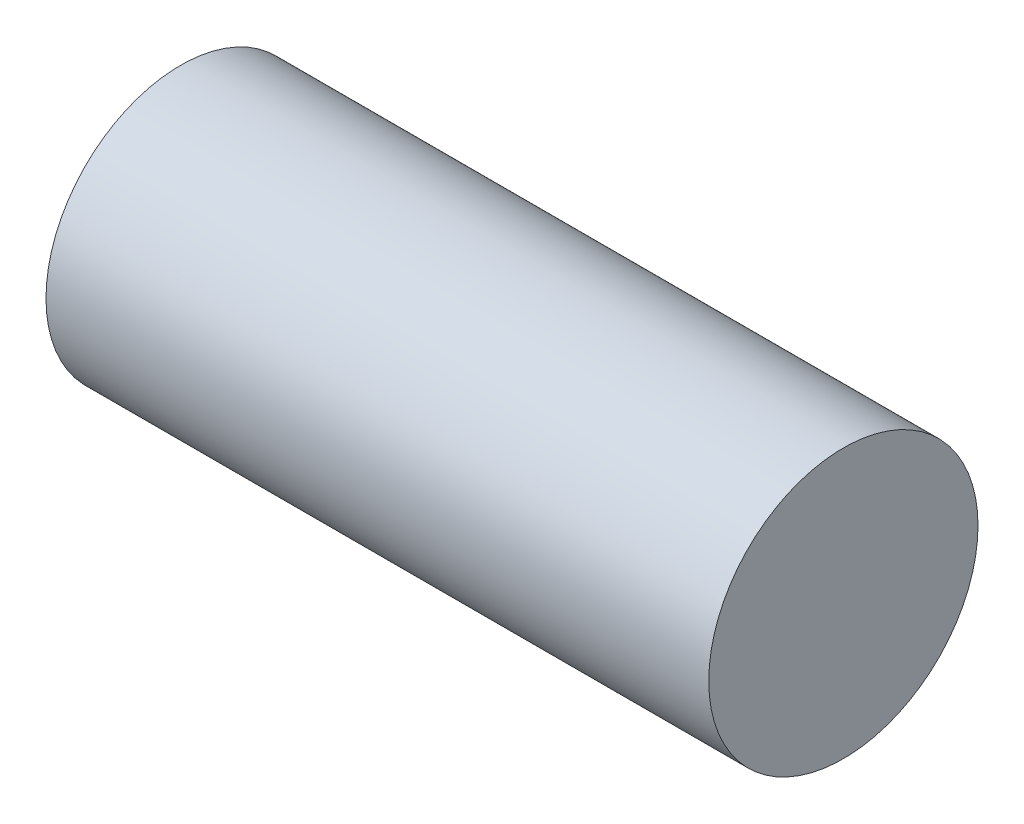
ISO-10303-21;
HEADER;
FILE_DESCRIPTION(('STEP AP214'),'2;1');
FILE_NAME('part.step','',(''),(''),'','','');
FILE_SCHEMA(('AUTOMOTIVE_DESIGN { 1 0 10303 214 1 1 1 1 }'));
ENDSEC;
DATA;
#1=APPLICATION_CONTEXT('core data for automotive mechanical design processes');
#2=APPLICATION_PROTOCOL_DEFINITION('international standard','automotive_design',2000,#1);
#3=PRODUCT_CONTEXT('',#1,'mechanical');
#4=PRODUCT('Part','Part','',(#3));
#5=PRODUCT_RELATED_PRODUCT_CATEGORY('part','',(#4));
#6=PRODUCT_DEFINITION_FORMATION('','',#4);
#7=PRODUCT_DEFINITION_CONTEXT('part definition',#1,'design');
#8=PRODUCT_DEFINITION('design','',#6,#7);
#9=PRODUCT_DEFINITION_SHAPE('','',#8);
#10=(LENGTH_UNIT() NAMED_UNIT(*) SI_UNIT(.MILLI.,.METRE.));
#11=(NAMED_UNIT(*) PLANE_ANGLE_UNIT() SI_UNIT($,.RADIAN.));
#12=(NAMED_UNIT(*) SI_UNIT($,.STERADIAN.) SOLID_ANGLE_UNIT());
#13=UNCERTAINTY_MEASURE_WITH_UNIT(LENGTH_MEASURE(1.E-05),#10,'distance_accuracy_value','');
#14=(GEOMETRIC_REPRESENTATION_CONTEXT(3) GLOBAL_UNCERTAINTY_ASSIGNED_CONTEXT((#13)) GLOBAL_UNIT_ASSIGNED_CONTEXT((#10,
#11,#12)) REPRESENTATION_CONTEXT('',''));
#15=CARTESIAN_POINT('',(0.,0.,0.));
#16=DIRECTION('',(0.,0.,1.));
#17=DIRECTION('',(1.,0.,0.));
#18=AXIS2_PLACEMENT_3D('',#15,#16,#17);
#19=CARTESIAN_POINT('',(0.,0.0895669291338588,0.));
#20=DIRECTION('',(-1.,0.,0.));
#21=DIRECTION('',(0.,0.,1.));
#22=AXIS2_PLACEMENT_3D('',#19,#20,#21);
#23=PLANE('',#22);
#24=CARTESIAN_POINT('',(0.,1.625,0.));
#25=DIRECTION('',(-1.,0.,0.));
#26=DIRECTION('',(0.,0.,1.));
#27=AXIS2_PLACEMENT_3D('',#24,#25,#26);
#28=CIRCLE('',#27,1.625);
#29=CARTESIAN_POINT('',(0.,1.625,1.625));
#30=VERTEX_POINT('',#29);
#31=EDGE_CURVE('E52',#30,#30,#28,.T.);
#32=ORIENTED_EDGE('',*,*,#31,.T.);
#33=EDGE_LOOP('',(#32));
#34=FACE_BOUND('',#33,.T.);
#35=ADVANCED_FACE('F45',(#34),#23,.T.);
#36=CARTESIAN_POINT('',(8.,1.625,0.));
#37=DIRECTION('',(1.,0.,0.));
#38=DIRECTION('',(0.,0.,-1.));
#39=AXIS2_PLACEMENT_3D('',#36,#37,#38);
#40=PLANE('',#39);
#41=CARTESIAN_POINT('',(8.,1.625,0.));
#42=DIRECTION('',(-1.,0.,0.));
#43=DIRECTION('',(0.,0.,1.));
#44=AXIS2_PLACEMENT_3D('',#41,#42,#43);
#45=CIRCLE('',#44,1.625);
#46=CARTESIAN_POINT('',(8.,1.625,1.625));
#47=VERTEX_POINT('',#46);
#48=EDGE_CURVE('E10',#47,#47,#45,.T.);
#49=ORIENTED_EDGE('',*,*,#48,.F.);
#50=EDGE_LOOP('',(#49));
#51=FACE_BOUND('',#50,.T.);
#52=ADVANCED_FACE('F62',(#51),#40,.T.);
#53=CARTESIAN_POINT('',(0.,1.625,0.));
#54=DIRECTION('',(-1.,0.,0.));
#55=DIRECTION('',(0.,0.,1.));
#56=AXIS2_PLACEMENT_3D('',#53,#54,#55);
#57=CYLINDRICAL_SURFACE('',#56,1.625);
#58=ORIENTED_EDGE('',*,*,#48,.T.);
#59=EDGE_LOOP('',(#58));
#60=FACE_BOUND('',#59,.T.);
#61=ORIENTED_EDGE('',*,*,#31,.F.);
#62=EDGE_LOOP('',(#61));
#63=FACE_BOUND('',#62,.T.);
#64=ADVANCED_FACE('F60',(#60,#63),#57,.T.);
#65=CLOSED_SHELL('',(#35,#52,#64));
#66=MANIFOLD_SOLID_BREP('B2',#65);
#67=ADVANCED_BREP_SHAPE_REPRESENTATION('',(#18,#66),#14);
#68=SHAPE_DEFINITION_REPRESENTATION(#9,#67);
ENDSEC;
END-ISO-10303-21;
